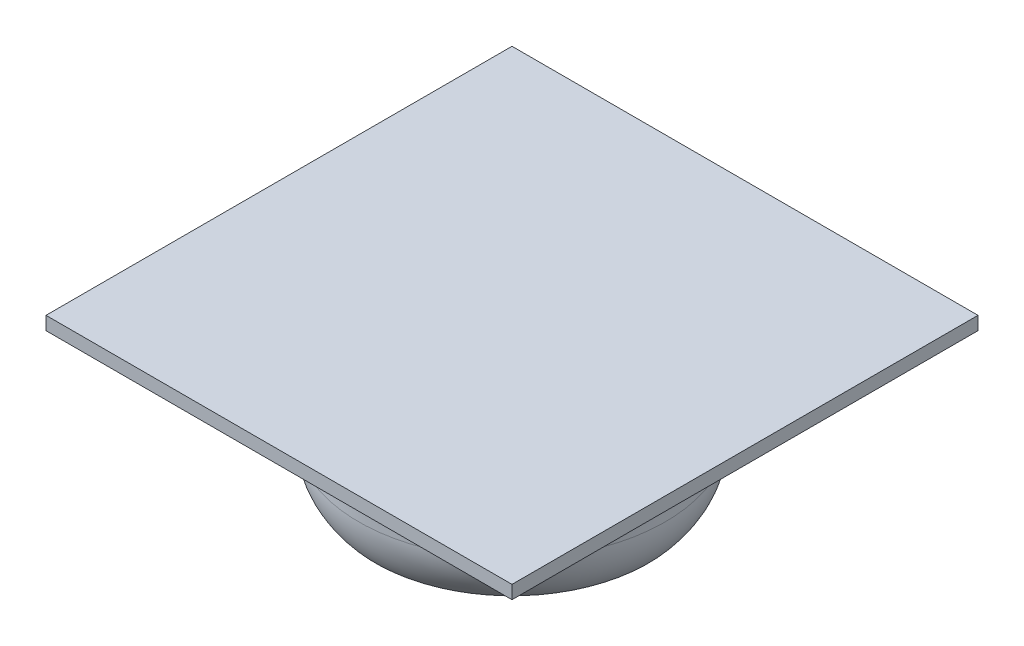
ISO-10303-21;
HEADER;
FILE_DESCRIPTION(('STEP AP214'),'2;1');
FILE_NAME('part.step','',(''),(''),'','','');
FILE_SCHEMA(('AUTOMOTIVE_DESIGN { 1 0 10303 214 1 1 1 1 }'));
ENDSEC;
DATA;
#1=APPLICATION_CONTEXT('core data for automotive mechanical design processes');
#2=APPLICATION_PROTOCOL_DEFINITION('international standard','automotive_design',2000,#1);
#3=PRODUCT_CONTEXT('',#1,'mechanical');
#4=PRODUCT('Part','Part','',(#3));
#5=PRODUCT_RELATED_PRODUCT_CATEGORY('part','',(#4));
#6=PRODUCT_DEFINITION_FORMATION('','',#4);
#7=PRODUCT_DEFINITION_CONTEXT('part definition',#1,'design');
#8=PRODUCT_DEFINITION('design','',#6,#7);
#9=PRODUCT_DEFINITION_SHAPE('','',#8);
#10=(LENGTH_UNIT() NAMED_UNIT(*) SI_UNIT(.MILLI.,.METRE.));
#11=(NAMED_UNIT(*) PLANE_ANGLE_UNIT() SI_UNIT($,.RADIAN.));
#12=(NAMED_UNIT(*) SI_UNIT($,.STERADIAN.) SOLID_ANGLE_UNIT());
#13=UNCERTAINTY_MEASURE_WITH_UNIT(LENGTH_MEASURE(1.E-05),#10,'distance_accuracy_value','');
#14=(GEOMETRIC_REPRESENTATION_CONTEXT(3) GLOBAL_UNCERTAINTY_ASSIGNED_CONTEXT((#13)) GLOBAL_UNIT_ASSIGNED_CONTEXT((#10,
#11,#12)) REPRESENTATION_CONTEXT('',''));
#15=CARTESIAN_POINT('',(0.,0.,0.));
#16=DIRECTION('',(0.,0.,1.));
#17=DIRECTION('',(1.,0.,0.));
#18=AXIS2_PLACEMENT_3D('',#15,#16,#17);
#19=CARTESIAN_POINT('',(0.,1.,0.));
#20=DIRECTION('',(1.,0.,0.));
#21=DIRECTION('',(0.,0.,-1.));
#22=AXIS2_PLACEMENT_3D('',#19,#20,#21);
#23=PLANE('',#22);
#24=DIRECTION('',(0.,0.,1.));
#25=VECTOR('',#24,1.);
#26=CARTESIAN_POINT('',(0.,0.,0.));
#27=LINE('',#26,#25);
#28=CARTESIAN_POINT('',(0.,0.,-35.));
#29=VERTEX_POINT('',#28);
#30=CARTESIAN_POINT('',(0.,0.,0.));
#31=VERTEX_POINT('',#30);
#32=EDGE_CURVE('E101',#29,#31,#27,.T.);
#33=ORIENTED_EDGE('',*,*,#32,.T.);
#34=DIRECTION('',(0.,-1.,0.));
#35=VECTOR('',#34,1.);
#36=CARTESIAN_POINT('',(0.,1.,0.));
#37=LINE('',#36,#35);
#38=CARTESIAN_POINT('',(0.,1.,0.));
#39=VERTEX_POINT('',#38);
#40=EDGE_CURVE('E92',#39,#31,#37,.T.);
#41=ORIENTED_EDGE('',*,*,#40,.F.);
#42=DIRECTION('',(0.,0.,1.));
#43=VECTOR('',#42,1.);
#44=CARTESIAN_POINT('',(0.,1.,0.));
#45=LINE('',#44,#43);
#46=CARTESIAN_POINT('',(0.,1.,-35.));
#47=VERTEX_POINT('',#46);
#48=EDGE_CURVE('E86',#47,#39,#45,.T.);
#49=ORIENTED_EDGE('',*,*,#48,.F.);
#50=DIRECTION('',(0.,-1.,0.));
#51=VECTOR('',#50,1.);
#52=CARTESIAN_POINT('',(0.,1.,-35.));
#53=LINE('',#52,#51);
#54=EDGE_CURVE('E97',#47,#29,#53,.T.);
#55=ORIENTED_EDGE('',*,*,#54,.T.);
#56=EDGE_LOOP('',(#33,#41,#49,#55));
#57=FACE_BOUND('',#56,.T.);
#58=ADVANCED_FACE('F33',(#57),#23,.F.);
#59=CARTESIAN_POINT('',(0.,1.,0.));
#60=DIRECTION('',(0.,0.,-1.));
#61=DIRECTION('',(-1.,0.,0.));
#62=AXIS2_PLACEMENT_3D('',#59,#60,#61);
#63=PLANE('',#62);
#64=DIRECTION('',(1.,0.,0.));
#65=VECTOR('',#64,1.);
#66=CARTESIAN_POINT('',(0.,0.,0.));
#67=LINE('',#66,#65);
#68=CARTESIAN_POINT('',(35.,0.,0.));
#69=VERTEX_POINT('',#68);
#70=EDGE_CURVE('E91',#31,#69,#67,.T.);
#71=ORIENTED_EDGE('',*,*,#70,.T.);
#72=DIRECTION('',(0.,-1.,0.));
#73=VECTOR('',#72,1.);
#74=CARTESIAN_POINT('',(35.,1.,0.));
#75=LINE('',#74,#73);
#76=CARTESIAN_POINT('',(35.,1.,0.));
#77=VERTEX_POINT('',#76);
#78=EDGE_CURVE('E89',#77,#69,#75,.T.);
#79=ORIENTED_EDGE('',*,*,#78,.F.);
#80=DIRECTION('',(1.,0.,0.));
#81=VECTOR('',#80,1.);
#82=CARTESIAN_POINT('',(0.,1.,0.));
#83=LINE('',#82,#81);
#84=EDGE_CURVE('E81',#39,#77,#83,.T.);
#85=ORIENTED_EDGE('',*,*,#84,.F.);
#86=ORIENTED_EDGE('',*,*,#40,.T.);
#87=EDGE_LOOP('',(#71,#79,#85,#86));
#88=FACE_BOUND('',#87,.T.);
#89=ADVANCED_FACE('F90',(#88),#63,.F.);
#90=CARTESIAN_POINT('',(35.,1.,0.));
#91=DIRECTION('',(-1.,0.,0.));
#92=DIRECTION('',(0.,0.,1.));
#93=AXIS2_PLACEMENT_3D('',#90,#91,#92);
#94=PLANE('',#93);
#95=DIRECTION('',(0.,0.,-1.));
#96=VECTOR('',#95,1.);
#97=CARTESIAN_POINT('',(35.,0.,0.));
#98=LINE('',#97,#96);
#99=CARTESIAN_POINT('',(35.,0.,-35.));
#100=VERTEX_POINT('',#99);
#101=EDGE_CURVE('E67',#69,#100,#98,.T.);
#102=ORIENTED_EDGE('',*,*,#101,.T.);
#103=DIRECTION('',(0.,-1.,0.));
#104=VECTOR('',#103,1.);
#105=CARTESIAN_POINT('',(35.,1.,-35.));
#106=LINE('',#105,#104);
#107=CARTESIAN_POINT('',(35.,1.,-35.));
#108=VERTEX_POINT('',#107);
#109=EDGE_CURVE('E93',#108,#100,#106,.T.);
#110=ORIENTED_EDGE('',*,*,#109,.F.);
#111=DIRECTION('',(0.,0.,-1.));
#112=VECTOR('',#111,1.);
#113=CARTESIAN_POINT('',(35.,1.,0.));
#114=LINE('',#113,#112);
#115=EDGE_CURVE('E84',#77,#108,#114,.T.);
#116=ORIENTED_EDGE('',*,*,#115,.F.);
#117=ORIENTED_EDGE('',*,*,#78,.T.);
#118=EDGE_LOOP('',(#102,#110,#116,#117));
#119=FACE_BOUND('',#118,.T.);
#120=ADVANCED_FACE('F95',(#119),#94,.F.);
#121=CARTESIAN_POINT('',(0.,1.,-35.));
#122=DIRECTION('',(0.,0.,1.));
#123=DIRECTION('',(1.,0.,0.));
#124=AXIS2_PLACEMENT_3D('',#121,#122,#123);
#125=PLANE('',#124);
#126=DIRECTION('',(-1.,0.,0.));
#127=VECTOR('',#126,1.);
#128=CARTESIAN_POINT('',(0.,0.,-35.));
#129=LINE('',#128,#127);
#130=EDGE_CURVE('E73',#100,#29,#129,.T.);
#131=ORIENTED_EDGE('',*,*,#130,.T.);
#132=ORIENTED_EDGE('',*,*,#54,.F.);
#133=DIRECTION('',(-1.,0.,0.));
#134=VECTOR('',#133,1.);
#135=CARTESIAN_POINT('',(0.,1.,-35.));
#136=LINE('',#135,#134);
#137=EDGE_CURVE('E50',#108,#47,#136,.T.);
#138=ORIENTED_EDGE('',*,*,#137,.F.);
#139=ORIENTED_EDGE('',*,*,#109,.T.);
#140=EDGE_LOOP('',(#131,#132,#138,#139));
#141=FACE_BOUND('',#140,.T.);
#142=ADVANCED_FACE('F139',(#141),#125,.F.);
#143=CARTESIAN_POINT('',(0.,1.,0.));
#144=DIRECTION('',(0.,-1.,0.));
#145=DIRECTION('',(0.,0.,-1.));
#146=AXIS2_PLACEMENT_3D('',#143,#144,#145);
#147=PLANE('',#146);
#148=ORIENTED_EDGE('',*,*,#48,.T.);
#149=ORIENTED_EDGE('',*,*,#84,.T.);
#150=ORIENTED_EDGE('',*,*,#115,.T.);
#151=ORIENTED_EDGE('',*,*,#137,.T.);
#152=EDGE_LOOP('',(#148,#149,#150,#151));
#153=FACE_BOUND('',#152,.T.);
#154=ADVANCED_FACE('F82',(#153),#147,.F.);
#155=CARTESIAN_POINT('',(0.,0.,0.));
#156=DIRECTION('',(0.,-1.,0.));
#157=DIRECTION('',(0.,0.,-1.));
#158=AXIS2_PLACEMENT_3D('',#155,#156,#157);
#159=PLANE('',#158);
#160=CARTESIAN_POINT('',(17.5,0.,-17.5));
#161=DIRECTION('',(0.,-1.,0.));
#162=DIRECTION('',(0.,0.,-1.));
#163=AXIS2_PLACEMENT_3D('',#160,#161,#162);
#164=CIRCLE('',#163,11.5);
#165=CARTESIAN_POINT('',(17.5,0.,-29.));
#166=VERTEX_POINT('',#165);
#167=EDGE_CURVE('E104',#166,#166,#164,.T.);
#168=ORIENTED_EDGE('',*,*,#167,.F.);
#169=EDGE_LOOP('',(#168));
#170=FACE_BOUND('',#169,.T.);
#171=ORIENTED_EDGE('',*,*,#32,.F.);
#172=ORIENTED_EDGE('',*,*,#130,.F.);
#173=ORIENTED_EDGE('',*,*,#101,.F.);
#174=ORIENTED_EDGE('',*,*,#70,.F.);
#175=EDGE_LOOP('',(#171,#172,#173,#174));
#176=FACE_BOUND('',#175,.T.);
#177=ADVANCED_FACE('F118',(#170,#176),#159,.T.);
#178=CARTESIAN_POINT('',(17.5,-10.,-17.5));
#179=DIRECTION('',(0.,1.,0.));
#180=DIRECTION('',(0.,0.,1.));
#181=AXIS2_PLACEMENT_3D('',#178,#179,#180);
#182=CYLINDRICAL_SURFACE('',#181,11.5);
#183=CARTESIAN_POINT('',(17.5,-6.69281086116926,-17.5));
#184=DIRECTION('',(0.,-1.,0.));
#185=DIRECTION('',(0.,0.,-1.));
#186=AXIS2_PLACEMENT_3D('',#183,#184,#185);
#187=CIRCLE('',#186,11.5);
#188=CARTESIAN_POINT('',(17.5,-6.69281086116926,-29.));
#189=VERTEX_POINT('',#188);
#190=EDGE_CURVE('E11',#189,#189,#187,.F.);
#191=ORIENTED_EDGE('',*,*,#190,.T.);
#192=EDGE_LOOP('',(#191));
#193=FACE_BOUND('',#192,.T.);
#194=ORIENTED_EDGE('',*,*,#167,.T.);
#195=EDGE_LOOP('',(#194));
#196=FACE_BOUND('',#195,.T.);
#197=ADVANCED_FACE('F124',(#193,#196),#182,.T.);
#198=CARTESIAN_POINT('',(17.5,-10.,-17.5));
#199=DIRECTION('',(0.,1.,0.));
#200=DIRECTION('',(0.,0.,1.));
#201=AXIS2_PLACEMENT_3D('',#198,#199,#200);
#202=CYLINDRICAL_SURFACE('',#201,10.25);
#203=CARTESIAN_POINT('',(17.5,-10.,-17.5));
#204=DIRECTION('',(0.,-1.,0.));
#205=DIRECTION('',(0.,0.,-1.));
#206=AXIS2_PLACEMENT_3D('',#203,#204,#205);
#207=CIRCLE('',#206,10.25);
#208=CARTESIAN_POINT('',(17.5,-10.,-27.75));
#209=VERTEX_POINT('',#208);
#210=EDGE_CURVE('E155',#209,#209,#207,.T.);
#211=ORIENTED_EDGE('',*,*,#210,.T.);
#212=EDGE_LOOP('',(#211));
#213=FACE_BOUND('',#212,.T.);
#214=CARTESIAN_POINT('',(17.5,0.,-17.5));
#215=DIRECTION('',(0.,-1.,0.));
#216=DIRECTION('',(0.,0.,-1.));
#217=AXIS2_PLACEMENT_3D('',#214,#215,#216);
#218=CIRCLE('',#217,10.25);
#219=CARTESIAN_POINT('',(17.5,0.,-27.75));
#220=VERTEX_POINT('',#219);
#221=EDGE_CURVE('E42',#220,#220,#218,.F.);
#222=ORIENTED_EDGE('',*,*,#221,.T.);
#223=EDGE_LOOP('',(#222));
#224=FACE_BOUND('',#223,.T.);
#225=ADVANCED_FACE('F113',(#213,#224),#202,.F.);
#226=ORIENTED_EDGE('',*,*,#221,.F.);
#227=EDGE_LOOP('',(#226));
#228=FACE_BOUND('',#227,.T.);
#229=ADVANCED_FACE('F115',(#228),#159,.T.);
#230=CARTESIAN_POINT('',(17.5,-6.69281086116926,-17.5));
#231=DIRECTION('',(0.,-1.,0.));
#232=DIRECTION('',(0.,0.,-1.));
#233=AXIS2_PLACEMENT_3D('',#230,#231,#232);
#234=TOROIDAL_SURFACE('',#233,6.5,5.);
#235=ORIENTED_EDGE('',*,*,#190,.F.);
#236=EDGE_LOOP('',(#235));
#237=FACE_BOUND('',#236,.T.);
#238=ORIENTED_EDGE('',*,*,#210,.F.);
#239=EDGE_LOOP('',(#238));
#240=FACE_BOUND('',#239,.T.);
#241=ADVANCED_FACE('F35',(#237,#240),#234,.T.);
#242=CLOSED_SHELL('',(#58,#89,#120,#142,#154,#177,#197,#225,#229,#241));
#243=MANIFOLD_SOLID_BREP('B2',#242);
#244=ADVANCED_BREP_SHAPE_REPRESENTATION('',(#18,#243),#14);
#245=SHAPE_DEFINITION_REPRESENTATION(#9,#244);
ENDSEC;
END-ISO-10303-21;
